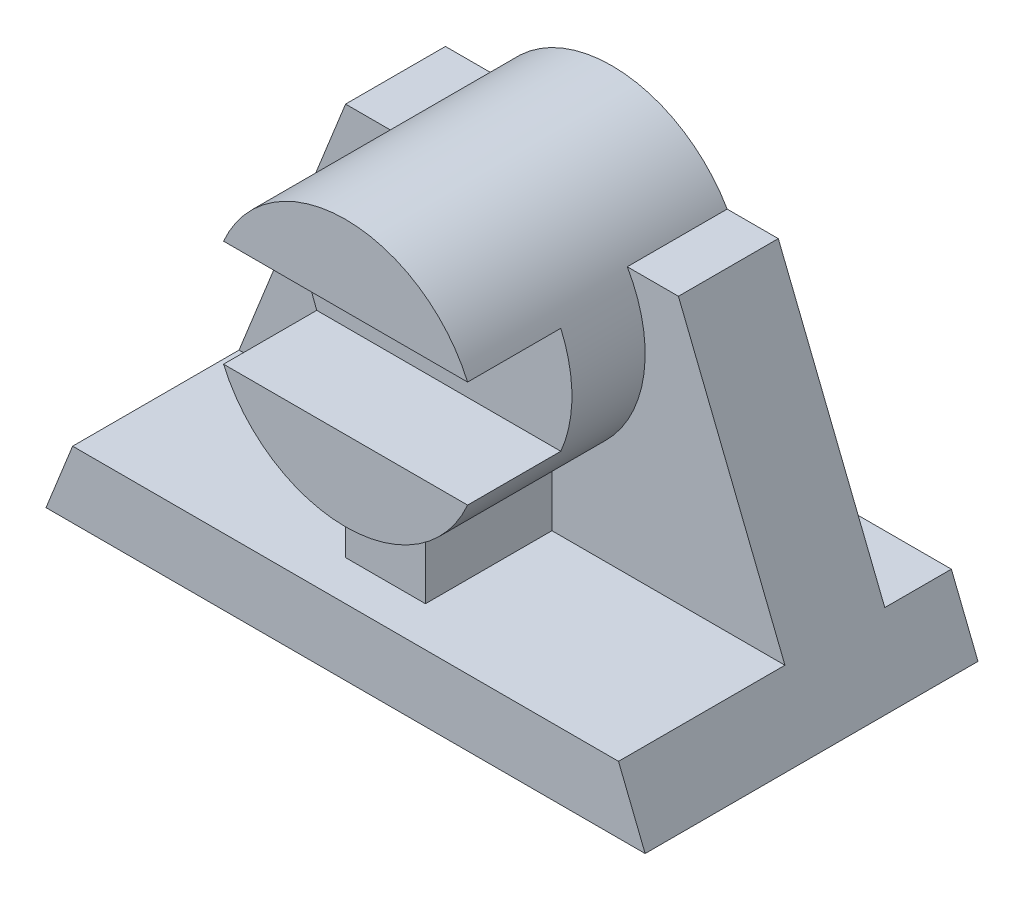
ISO-10303-21;
HEADER;
FILE_DESCRIPTION(('STEP AP214'),'2;1');
FILE_NAME('part.step','',(''),(''),'','','');
FILE_SCHEMA(('AUTOMOTIVE_DESIGN { 1 0 10303 214 1 1 1 1 }'));
ENDSEC;
DATA;
#1=APPLICATION_CONTEXT('core data for automotive mechanical design processes');
#2=APPLICATION_PROTOCOL_DEFINITION('international standard','automotive_design',2000,#1);
#3=PRODUCT_CONTEXT('',#1,'mechanical');
#4=PRODUCT('Part','Part','',(#3));
#5=PRODUCT_RELATED_PRODUCT_CATEGORY('part','',(#4));
#6=PRODUCT_DEFINITION_FORMATION('','',#4);
#7=PRODUCT_DEFINITION_CONTEXT('part definition',#1,'design');
#8=PRODUCT_DEFINITION('design','',#6,#7);
#9=PRODUCT_DEFINITION_SHAPE('','',#8);
#10=(LENGTH_UNIT() NAMED_UNIT(*) SI_UNIT(.MILLI.,.METRE.));
#11=(NAMED_UNIT(*) PLANE_ANGLE_UNIT() SI_UNIT($,.RADIAN.));
#12=(NAMED_UNIT(*) SI_UNIT($,.STERADIAN.) SOLID_ANGLE_UNIT());
#13=UNCERTAINTY_MEASURE_WITH_UNIT(LENGTH_MEASURE(1.E-05),#10,'distance_accuracy_value','');
#14=(GEOMETRIC_REPRESENTATION_CONTEXT(3) GLOBAL_UNCERTAINTY_ASSIGNED_CONTEXT((#13)) GLOBAL_UNIT_ASSIGNED_CONTEXT((#10,
#11,#12)) REPRESENTATION_CONTEXT('',''));
#15=CARTESIAN_POINT('',(0.,0.,0.));
#16=DIRECTION('',(0.,0.,1.));
#17=DIRECTION('',(1.,0.,0.));
#18=AXIS2_PLACEMENT_3D('',#15,#16,#17);
#19=CARTESIAN_POINT('',(0.,0.,40.));
#20=DIRECTION('',(0.,0.,1.));
#21=DIRECTION('',(1.,0.,0.));
#22=AXIS2_PLACEMENT_3D('',#19,#20,#21);
#23=PLANE('',#22);
#24=DIRECTION('',(-1.,0.,0.));
#25=VECTOR('',#24,1.);
#26=CARTESIAN_POINT('',(0.,15.52297370401,40.));
#27=LINE('',#26,#25);
#28=CARTESIAN_POINT('',(-1.36599563520437,15.52297370401,40.));
#29=VERTEX_POINT('',#28);
#30=CARTESIAN_POINT('',(-38.0266011948511,15.52297370401,40.));
#31=VERTEX_POINT('',#30);
#32=EDGE_CURVE('E173',#29,#31,#27,.T.);
#33=ORIENTED_EDGE('',*,*,#32,.F.);
#34=CARTESIAN_POINT('',(-19.6962984150277,7.52297370401,40.));
#35=DIRECTION('',(0.,0.,1.));
#36=DIRECTION('',(1.,0.,0.));
#37=AXIS2_PLACEMENT_3D('',#34,#35,#36);
#38=CIRCLE('',#37,20.);
#39=EDGE_CURVE('E188',#29,#31,#38,.T.);
#40=ORIENTED_EDGE('',*,*,#39,.T.);
#41=EDGE_LOOP('',(#33,#40));
#42=FACE_BOUND('',#41,.T.);
#43=ADVANCED_FACE('F41',(#42),#23,.T.);
#44=CARTESIAN_POINT('',(0.,-22.47702629599,-10.));
#45=DIRECTION('',(0.,-1.,0.));
#46=DIRECTION('',(0.,0.,-1.));
#47=AXIS2_PLACEMENT_3D('',#44,#45,#46);
#48=PLANE('',#47);
#49=DIRECTION('',(0.,0.,1.));
#50=VECTOR('',#49,1.);
#51=CARTESIAN_POINT('',(-60.6962984150277,-22.47702629599,-10.));
#52=LINE('',#51,#50);
#53=CARTESIAN_POINT('',(-60.6962984150277,-22.47702629599,-10.));
#54=VERTEX_POINT('',#53);
#55=CARTESIAN_POINT('',(-60.6962984150277,-22.47702629599,0.));
#56=VERTEX_POINT('',#55);
#57=EDGE_CURVE('E341',#54,#56,#52,.T.);
#58=ORIENTED_EDGE('',*,*,#57,.T.);
#59=DIRECTION('',(1.,0.,0.));
#60=VECTOR('',#59,1.);
#61=CARTESIAN_POINT('',(0.,-22.47702629599,0.));
#62=LINE('',#61,#60);
#63=CARTESIAN_POINT('',(21.3037015849723,-22.47702629599,0.));
#64=VERTEX_POINT('',#63);
#65=EDGE_CURVE('E262',#56,#64,#62,.T.);
#66=ORIENTED_EDGE('',*,*,#65,.T.);
#67=DIRECTION('',(0.,0.,1.));
#68=VECTOR('',#67,1.);
#69=CARTESIAN_POINT('',(21.3037015849723,-22.47702629599,-10.));
#70=LINE('',#69,#68);
#71=CARTESIAN_POINT('',(21.3037015849723,-22.47702629599,-10.));
#72=VERTEX_POINT('',#71);
#73=EDGE_CURVE('E174',#72,#64,#70,.T.);
#74=ORIENTED_EDGE('',*,*,#73,.F.);
#75=DIRECTION('',(1.,0.,0.));
#76=VECTOR('',#75,1.);
#77=CARTESIAN_POINT('',(0.,-22.47702629599,-10.));
#78=LINE('',#77,#76);
#79=EDGE_CURVE('E315',#54,#72,#78,.T.);
#80=ORIENTED_EDGE('',*,*,#79,.F.);
#81=EDGE_LOOP('',(#58,#66,#74,#80));
#82=FACE_BOUND('',#81,.T.);
#83=ADVANCED_FACE('F367',(#82),#48,.F.);
#84=DIRECTION('',(1.,0.,0.));
#85=VECTOR('',#84,1.);
#86=CARTESIAN_POINT('',(0.,-22.47702629599,34.));
#87=LINE('',#86,#85);
#88=CARTESIAN_POINT('',(-25.6962984150277,-22.47702629599,34.));
#89=VERTEX_POINT('',#88);
#90=CARTESIAN_POINT('',(-13.6962984150278,-22.47702629599,34.));
#91=VERTEX_POINT('',#90);
#92=EDGE_CURVE('E65',#89,#91,#87,.T.);
#93=ORIENTED_EDGE('',*,*,#92,.F.);
#94=DIRECTION('',(0.,0.,-1.));
#95=VECTOR('',#94,1.);
#96=CARTESIAN_POINT('',(-25.6962984150277,-22.47702629599,34.));
#97=LINE('',#96,#95);
#98=CARTESIAN_POINT('',(-25.6962984150277,-22.47702629599,15.));
#99=VERTEX_POINT('',#98);
#100=EDGE_CURVE('E222',#89,#99,#97,.T.);
#101=ORIENTED_EDGE('',*,*,#100,.T.);
#102=DIRECTION('',(1.,0.,0.));
#103=VECTOR('',#102,1.);
#104=CARTESIAN_POINT('',(0.,-22.47702629599,15.));
#105=LINE('',#104,#103);
#106=CARTESIAN_POINT('',(-60.6962984150277,-22.47702629599,15.));
#107=VERTEX_POINT('',#106);
#108=EDGE_CURVE('E243',#107,#99,#105,.T.);
#109=ORIENTED_EDGE('',*,*,#108,.F.);
#110=CARTESIAN_POINT('',(-60.6962984150277,-22.47702629599,40.));
#111=VERTEX_POINT('',#110);
#112=EDGE_CURVE('E330',#107,#111,#52,.T.);
#113=ORIENTED_EDGE('',*,*,#112,.T.);
#114=DIRECTION('',(1.,0.,0.));
#115=VECTOR('',#114,1.);
#116=CARTESIAN_POINT('',(0.,-22.47702629599,40.));
#117=LINE('',#116,#115);
#118=CARTESIAN_POINT('',(21.3037015849723,-22.47702629599,40.));
#119=VERTEX_POINT('',#118);
#120=EDGE_CURVE('E299',#111,#119,#117,.T.);
#121=ORIENTED_EDGE('',*,*,#120,.T.);
#122=CARTESIAN_POINT('',(21.3037015849723,-22.47702629599,15.));
#123=VERTEX_POINT('',#122);
#124=EDGE_CURVE('E334',#123,#119,#70,.T.);
#125=ORIENTED_EDGE('',*,*,#124,.F.);
#126=DIRECTION('',(1.,0.,0.));
#127=VECTOR('',#126,1.);
#128=CARTESIAN_POINT('',(0.,-22.47702629599,15.));
#129=LINE('',#128,#127);
#130=CARTESIAN_POINT('',(-13.6962984150278,-22.47702629599,15.));
#131=VERTEX_POINT('',#130);
#132=EDGE_CURVE('E272',#131,#123,#129,.T.);
#133=ORIENTED_EDGE('',*,*,#132,.F.);
#134=DIRECTION('',(0.,0.,-1.));
#135=VECTOR('',#134,1.);
#136=CARTESIAN_POINT('',(-13.6962984150278,-22.47702629599,34.));
#137=LINE('',#136,#135);
#138=EDGE_CURVE('E218',#91,#131,#137,.T.);
#139=ORIENTED_EDGE('',*,*,#138,.F.);
#140=EDGE_LOOP('',(#93,#101,#109,#113,#121,#125,#133,#139));
#141=FACE_BOUND('',#140,.T.);
#142=ADVANCED_FACE('F43',(#141),#48,.F.);
#143=CARTESIAN_POINT('',(10.6145612642899,4.24582450571596,-10.));
#144=DIRECTION('',(-0.928476690885259,-0.371390676354104,0.));
#145=DIRECTION('',(0.371390676354104,-0.928476690885259,0.));
#146=AXIS2_PLACEMENT_3D('',#143,#144,#145);
#147=PLANE('',#146);
#148=ORIENTED_EDGE('',*,*,#73,.T.);
#149=DIRECTION('',(0.371390676354104,-0.928476690885259,0.));
#150=VECTOR('',#149,1.);
#151=CARTESIAN_POINT('',(10.6145612642899,4.24582450571596,0.));
#152=LINE('',#151,#150);
#153=CARTESIAN_POINT('',(5.30370158497228,17.52297370401,0.));
#154=VERTEX_POINT('',#153);
#155=EDGE_CURVE('E287',#154,#64,#152,.T.);
#156=ORIENTED_EDGE('',*,*,#155,.F.);
#157=DIRECTION('',(0.,0.,-1.));
#158=VECTOR('',#157,1.);
#159=CARTESIAN_POINT('',(5.30370158497228,17.52297370401,15.));
#160=LINE('',#159,#158);
#161=CARTESIAN_POINT('',(5.30370158497228,17.52297370401,15.));
#162=VERTEX_POINT('',#161);
#163=EDGE_CURVE('E296',#162,#154,#160,.T.);
#164=ORIENTED_EDGE('',*,*,#163,.F.);
#165=DIRECTION('',(0.371390676354104,-0.928476690885259,0.));
#166=VECTOR('',#165,1.);
#167=CARTESIAN_POINT('',(10.6145612642899,4.24582450571596,15.));
#168=LINE('',#167,#166);
#169=EDGE_CURVE('E275',#162,#123,#168,.T.);
#170=ORIENTED_EDGE('',*,*,#169,.T.);
#171=ORIENTED_EDGE('',*,*,#124,.T.);
#172=DIRECTION('',(0.371390676354104,-0.928476690885259,0.));
#173=VECTOR('',#172,1.);
#174=CARTESIAN_POINT('',(10.6145612642899,4.24582450571596,40.));
#175=LINE('',#174,#173);
#176=CARTESIAN_POINT('',(25.3037015849723,-32.47702629599,40.));
#177=VERTEX_POINT('',#176);
#178=EDGE_CURVE('E311',#119,#177,#175,.T.);
#179=ORIENTED_EDGE('',*,*,#178,.T.);
#180=DIRECTION('',(0.,0.,1.));
#181=VECTOR('',#180,1.);
#182=CARTESIAN_POINT('',(25.3037015849723,-32.47702629599,-10.));
#183=LINE('',#182,#181);
#184=CARTESIAN_POINT('',(25.3037015849723,-32.47702629599,-10.));
#185=VERTEX_POINT('',#184);
#186=EDGE_CURVE('E335',#185,#177,#183,.T.);
#187=ORIENTED_EDGE('',*,*,#186,.F.);
#188=DIRECTION('',(0.371390676354104,-0.928476690885259,0.));
#189=VECTOR('',#188,1.);
#190=CARTESIAN_POINT('',(10.6145612642899,4.24582450571596,-10.));
#191=LINE('',#190,#189);
#192=EDGE_CURVE('E327',#72,#185,#191,.T.);
#193=ORIENTED_EDGE('',*,*,#192,.F.);
#194=EDGE_LOOP('',(#148,#156,#164,#170,#171,#179,#187,#193));
#195=FACE_BOUND('',#194,.T.);
#196=ADVANCED_FACE('F425',(#195),#147,.F.);
#197=CARTESIAN_POINT('',(0.,-32.47702629599,-10.));
#198=DIRECTION('',(0.,-1.,0.));
#199=DIRECTION('',(0.,0.,-1.));
#200=AXIS2_PLACEMENT_3D('',#197,#198,#199);
#201=PLANE('',#200);
#202=ORIENTED_EDGE('',*,*,#186,.T.);
#203=DIRECTION('',(1.,0.,0.));
#204=VECTOR('',#203,1.);
#205=CARTESIAN_POINT('',(0.,-32.47702629599,40.));
#206=LINE('',#205,#204);
#207=CARTESIAN_POINT('',(-64.6962984150277,-32.47702629599,40.));
#208=VERTEX_POINT('',#207);
#209=EDGE_CURVE('E307',#208,#177,#206,.T.);
#210=ORIENTED_EDGE('',*,*,#209,.F.);
#211=DIRECTION('',(0.,0.,1.));
#212=VECTOR('',#211,1.);
#213=CARTESIAN_POINT('',(-64.6962984150277,-32.47702629599,-10.));
#214=LINE('',#213,#212);
#215=CARTESIAN_POINT('',(-64.6962984150277,-32.47702629599,-10.));
#216=VERTEX_POINT('',#215);
#217=EDGE_CURVE('E338',#216,#208,#214,.T.);
#218=ORIENTED_EDGE('',*,*,#217,.F.);
#219=DIRECTION('',(1.,0.,0.));
#220=VECTOR('',#219,1.);
#221=CARTESIAN_POINT('',(0.,-32.47702629599,-10.));
#222=LINE('',#221,#220);
#223=EDGE_CURVE('E323',#216,#185,#222,.T.);
#224=ORIENTED_EDGE('',*,*,#223,.T.);
#225=EDGE_LOOP('',(#202,#210,#218,#224));
#226=FACE_BOUND('',#225,.T.);
#227=ADVANCED_FACE('F428',(#226),#201,.T.);
#228=CARTESIAN_POINT('',(-44.5736964626136,17.8294785850454,-10.));
#229=DIRECTION('',(-0.928476690885259,0.371390676354104,0.));
#230=DIRECTION('',(-0.371390676354104,-0.928476690885259,0.));
#231=AXIS2_PLACEMENT_3D('',#228,#229,#230);
#232=PLANE('',#231);
#233=ORIENTED_EDGE('',*,*,#217,.T.);
#234=DIRECTION('',(-0.371390676354104,-0.928476690885259,0.));
#235=VECTOR('',#234,1.);
#236=CARTESIAN_POINT('',(-44.5736964626136,17.8294785850454,40.));
#237=LINE('',#236,#235);
#238=EDGE_CURVE('E303',#111,#208,#237,.T.);
#239=ORIENTED_EDGE('',*,*,#238,.F.);
#240=ORIENTED_EDGE('',*,*,#112,.F.);
#241=DIRECTION('',(-0.371390676354104,-0.928476690885259,0.));
#242=VECTOR('',#241,1.);
#243=CARTESIAN_POINT('',(-44.5736964626136,17.8294785850454,15.));
#244=LINE('',#243,#242);
#245=CARTESIAN_POINT('',(-44.6962984150277,17.52297370401,15.));
#246=VERTEX_POINT('',#245);
#247=EDGE_CURVE('E239',#246,#107,#244,.T.);
#248=ORIENTED_EDGE('',*,*,#247,.F.);
#249=DIRECTION('',(0.,0.,-1.));
#250=VECTOR('',#249,1.);
#251=CARTESIAN_POINT('',(-44.6962984150277,17.52297370401,15.));
#252=LINE('',#251,#250);
#253=CARTESIAN_POINT('',(-44.6962984150277,17.52297370401,0.));
#254=VERTEX_POINT('',#253);
#255=EDGE_CURVE('E250',#246,#254,#252,.T.);
#256=ORIENTED_EDGE('',*,*,#255,.T.);
#257=DIRECTION('',(-0.371390676354104,-0.928476690885259,0.));
#258=VECTOR('',#257,1.);
#259=CARTESIAN_POINT('',(-44.5736964626136,17.8294785850454,0.));
#260=LINE('',#259,#258);
#261=EDGE_CURVE('E235',#254,#56,#260,.T.);
#262=ORIENTED_EDGE('',*,*,#261,.T.);
#263=ORIENTED_EDGE('',*,*,#57,.F.);
#264=DIRECTION('',(-0.371390676354104,-0.928476690885259,0.));
#265=VECTOR('',#264,1.);
#266=CARTESIAN_POINT('',(-44.5736964626136,17.8294785850454,-10.));
#267=LINE('',#266,#265);
#268=EDGE_CURVE('E319',#54,#216,#267,.T.);
#269=ORIENTED_EDGE('',*,*,#268,.T.);
#270=EDGE_LOOP('',(#233,#239,#240,#248,#256,#262,#263,#269));
#271=FACE_BOUND('',#270,.T.);
#272=ADVANCED_FACE('F423',(#271),#232,.T.);
#273=CARTESIAN_POINT('',(0.,0.,-10.));
#274=DIRECTION('',(0.,0.,1.));
#275=DIRECTION('',(1.,0.,0.));
#276=AXIS2_PLACEMENT_3D('',#273,#274,#275);
#277=PLANE('',#276);
#278=ORIENTED_EDGE('',*,*,#79,.T.);
#279=ORIENTED_EDGE('',*,*,#192,.T.);
#280=ORIENTED_EDGE('',*,*,#223,.F.);
#281=ORIENTED_EDGE('',*,*,#268,.F.);
#282=EDGE_LOOP('',(#278,#279,#280,#281));
#283=FACE_BOUND('',#282,.T.);
#284=ADVANCED_FACE('F419',(#283),#277,.F.);
#285=CARTESIAN_POINT('',(0.,0.,40.));
#286=DIRECTION('',(0.,0.,1.));
#287=DIRECTION('',(1.,0.,0.));
#288=AXIS2_PLACEMENT_3D('',#285,#286,#287);
#289=PLANE('',#288);
#290=ORIENTED_EDGE('',*,*,#120,.F.);
#291=ORIENTED_EDGE('',*,*,#238,.T.);
#292=ORIENTED_EDGE('',*,*,#209,.T.);
#293=ORIENTED_EDGE('',*,*,#178,.F.);
#294=EDGE_LOOP('',(#290,#291,#292,#293));
#295=FACE_BOUND('',#294,.T.);
#296=ADVANCED_FACE('F415',(#295),#289,.T.);
#297=CARTESIAN_POINT('',(0.,17.52297370401,15.));
#298=DIRECTION('',(0.,1.,0.));
#299=DIRECTION('',(0.,0.,1.));
#300=AXIS2_PLACEMENT_3D('',#297,#298,#299);
#301=PLANE('',#300);
#302=DIRECTION('',(1.,0.,0.));
#303=VECTOR('',#302,1.);
#304=CARTESIAN_POINT('',(0.,17.52297370401,0.));
#305=LINE('',#304,#303);
#306=CARTESIAN_POINT('',(-2.37579033933896,17.52297370401,0.));
#307=VERTEX_POINT('',#306);
#308=EDGE_CURVE('E268',#307,#154,#305,.T.);
#309=ORIENTED_EDGE('',*,*,#308,.F.);
#310=DIRECTION('',(0.,0.,-1.));
#311=VECTOR('',#310,1.);
#312=CARTESIAN_POINT('',(-2.37579033933896,17.52297370401,15.));
#313=LINE('',#312,#311);
#314=CARTESIAN_POINT('',(-2.37579033933896,17.52297370401,15.));
#315=VERTEX_POINT('',#314);
#316=EDGE_CURVE('E283',#315,#307,#313,.T.);
#317=ORIENTED_EDGE('',*,*,#316,.F.);
#318=DIRECTION('',(1.,0.,0.));
#319=VECTOR('',#318,1.);
#320=CARTESIAN_POINT('',(0.,17.52297370401,15.));
#321=LINE('',#320,#319);
#322=EDGE_CURVE('E279',#315,#162,#321,.T.);
#323=ORIENTED_EDGE('',*,*,#322,.T.);
#324=ORIENTED_EDGE('',*,*,#163,.T.);
#325=EDGE_LOOP('',(#309,#317,#323,#324));
#326=FACE_BOUND('',#325,.T.);
#327=ADVANCED_FACE('F408',(#326),#301,.T.);
#328=CARTESIAN_POINT('',(0.,0.,15.));
#329=DIRECTION('',(0.,0.,1.));
#330=DIRECTION('',(1.,0.,0.));
#331=AXIS2_PLACEMENT_3D('',#328,#329,#330);
#332=PLANE('',#331);
#333=CARTESIAN_POINT('',(-19.6962984150277,7.52297370401,15.));
#334=DIRECTION('',(0.,0.,1.));
#335=DIRECTION('',(1.,0.,0.));
#336=AXIS2_PLACEMENT_3D('',#333,#334,#335);
#337=CIRCLE('',#336,20.);
#338=CARTESIAN_POINT('',(-13.6962984150278,-11.5558103243289,15.));
#339=VERTEX_POINT('',#338);
#340=EDGE_CURVE('E263',#339,#315,#337,.T.);
#341=ORIENTED_EDGE('',*,*,#340,.F.);
#342=DIRECTION('',(0.,1.,0.));
#343=VECTOR('',#342,1.);
#344=CARTESIAN_POINT('',(-13.6962984150278,0.,15.));
#345=LINE('',#344,#343);
#346=EDGE_CURVE('E267',#131,#339,#345,.T.);
#347=ORIENTED_EDGE('',*,*,#346,.F.);
#348=ORIENTED_EDGE('',*,*,#132,.T.);
#349=ORIENTED_EDGE('',*,*,#169,.F.);
#350=ORIENTED_EDGE('',*,*,#322,.F.);
#351=EDGE_LOOP('',(#341,#347,#348,#349,#350));
#352=FACE_BOUND('',#351,.T.);
#353=ADVANCED_FACE('F405',(#352),#332,.T.);
#354=CARTESIAN_POINT('',(0.,0.,0.));
#355=DIRECTION('',(0.,0.,1.));
#356=DIRECTION('',(1.,0.,0.));
#357=AXIS2_PLACEMENT_3D('',#354,#355,#356);
#358=PLANE('',#357);
#359=DIRECTION('',(1.,0.,0.));
#360=VECTOR('',#359,1.);
#361=CARTESIAN_POINT('',(0.,17.52297370401,0.));
#362=LINE('',#361,#360);
#363=CARTESIAN_POINT('',(-37.0168064907165,17.52297370401,0.));
#364=VERTEX_POINT('',#363);
#365=EDGE_CURVE('E229',#254,#364,#362,.T.);
#366=ORIENTED_EDGE('',*,*,#365,.T.);
#367=CARTESIAN_POINT('',(-19.6962984150277,7.52297370401,0.));
#368=DIRECTION('',(0.,0.,1.));
#369=DIRECTION('',(1.,0.,0.));
#370=AXIS2_PLACEMENT_3D('',#367,#368,#369);
#371=CIRCLE('',#370,20.);
#372=EDGE_CURVE('E189',#307,#364,#371,.T.);
#373=ORIENTED_EDGE('',*,*,#372,.F.);
#374=ORIENTED_EDGE('',*,*,#308,.T.);
#375=ORIENTED_EDGE('',*,*,#155,.T.);
#376=ORIENTED_EDGE('',*,*,#65,.F.);
#377=ORIENTED_EDGE('',*,*,#261,.F.);
#378=EDGE_LOOP('',(#366,#373,#374,#375,#376,#377));
#379=FACE_BOUND('',#378,.T.);
#380=ADVANCED_FACE('F403',(#379),#358,.F.);
#381=CARTESIAN_POINT('',(0.,17.52297370401,15.));
#382=DIRECTION('',(0.,1.,0.));
#383=DIRECTION('',(0.,0.,1.));
#384=AXIS2_PLACEMENT_3D('',#381,#382,#383);
#385=PLANE('',#384);
#386=ORIENTED_EDGE('',*,*,#365,.F.);
#387=ORIENTED_EDGE('',*,*,#255,.F.);
#388=DIRECTION('',(1.,0.,0.));
#389=VECTOR('',#388,1.);
#390=CARTESIAN_POINT('',(0.,17.52297370401,15.));
#391=LINE('',#390,#389);
#392=CARTESIAN_POINT('',(-37.0168064907165,17.52297370401,15.));
#393=VERTEX_POINT('',#392);
#394=EDGE_CURVE('E234',#246,#393,#391,.T.);
#395=ORIENTED_EDGE('',*,*,#394,.T.);
#396=DIRECTION('',(0.,0.,-1.));
#397=VECTOR('',#396,1.);
#398=CARTESIAN_POINT('',(-37.0168064907165,17.52297370401,15.));
#399=LINE('',#398,#397);
#400=EDGE_CURVE('E259',#393,#364,#399,.T.);
#401=ORIENTED_EDGE('',*,*,#400,.T.);
#402=EDGE_LOOP('',(#386,#387,#395,#401));
#403=FACE_BOUND('',#402,.T.);
#404=ADVANCED_FACE('F399',(#403),#385,.T.);
#405=CARTESIAN_POINT('',(0.,0.,15.));
#406=DIRECTION('',(0.,0.,1.));
#407=DIRECTION('',(1.,0.,0.));
#408=AXIS2_PLACEMENT_3D('',#405,#406,#407);
#409=PLANE('',#408);
#410=CARTESIAN_POINT('',(-19.6962984150277,7.52297370401,15.));
#411=DIRECTION('',(0.,0.,1.));
#412=DIRECTION('',(1.,0.,0.));
#413=AXIS2_PLACEMENT_3D('',#410,#411,#412);
#414=CIRCLE('',#413,20.);
#415=CARTESIAN_POINT('',(-25.6962984150277,-11.5558103243289,15.));
#416=VERTEX_POINT('',#415);
#417=EDGE_CURVE('E230',#393,#416,#414,.T.);
#418=ORIENTED_EDGE('',*,*,#417,.F.);
#419=ORIENTED_EDGE('',*,*,#394,.F.);
#420=ORIENTED_EDGE('',*,*,#247,.T.);
#421=ORIENTED_EDGE('',*,*,#108,.T.);
#422=DIRECTION('',(0.,1.,0.));
#423=VECTOR('',#422,1.);
#424=CARTESIAN_POINT('',(-25.6962984150277,0.,15.));
#425=LINE('',#424,#423);
#426=EDGE_CURVE('E247',#99,#416,#425,.T.);
#427=ORIENTED_EDGE('',*,*,#426,.T.);
#428=EDGE_LOOP('',(#418,#419,#420,#421,#427));
#429=FACE_BOUND('',#428,.T.);
#430=ADVANCED_FACE('F395',(#429),#409,.T.);
#431=CARTESIAN_POINT('',(-25.6962984150277,0.,34.));
#432=DIRECTION('',(-1.,0.,0.));
#433=DIRECTION('',(0.,0.,1.));
#434=AXIS2_PLACEMENT_3D('',#431,#432,#433);
#435=PLANE('',#434);
#436=DIRECTION('',(0.,0.,-1.));
#437=VECTOR('',#436,1.);
#438=CARTESIAN_POINT('',(-25.6962984150277,-11.5558103243289,34.));
#439=LINE('',#438,#437);
#440=CARTESIAN_POINT('',(-25.6962984150277,-11.5558103243289,34.));
#441=VERTEX_POINT('',#440);
#442=EDGE_CURVE('E225',#441,#416,#439,.T.);
#443=ORIENTED_EDGE('',*,*,#442,.T.);
#444=ORIENTED_EDGE('',*,*,#426,.F.);
#445=ORIENTED_EDGE('',*,*,#100,.F.);
#446=DIRECTION('',(0.,1.,0.));
#447=VECTOR('',#446,1.);
#448=CARTESIAN_POINT('',(-25.6962984150277,0.,34.));
#449=LINE('',#448,#447);
#450=EDGE_CURVE('E204',#89,#441,#449,.T.);
#451=ORIENTED_EDGE('',*,*,#450,.T.);
#452=EDGE_LOOP('',(#443,#444,#445,#451));
#453=FACE_BOUND('',#452,.T.);
#454=ADVANCED_FACE('F391',(#453),#435,.T.);
#455=CARTESIAN_POINT('',(-13.6962984150278,0.,34.));
#456=DIRECTION('',(-1.,0.,0.));
#457=DIRECTION('',(0.,0.,1.));
#458=AXIS2_PLACEMENT_3D('',#455,#456,#457);
#459=PLANE('',#458);
#460=ORIENTED_EDGE('',*,*,#346,.T.);
#461=DIRECTION('',(0.,0.,-1.));
#462=VECTOR('',#461,1.);
#463=CARTESIAN_POINT('',(-13.6962984150278,-11.5558103243289,34.));
#464=LINE('',#463,#462);
#465=CARTESIAN_POINT('',(-13.6962984150278,-11.5558103243289,34.));
#466=VERTEX_POINT('',#465);
#467=EDGE_CURVE('E214',#466,#339,#464,.T.);
#468=ORIENTED_EDGE('',*,*,#467,.F.);
#469=DIRECTION('',(0.,1.,0.));
#470=VECTOR('',#469,1.);
#471=CARTESIAN_POINT('',(-13.6962984150278,0.,34.));
#472=LINE('',#471,#470);
#473=EDGE_CURVE('E210',#91,#466,#472,.T.);
#474=ORIENTED_EDGE('',*,*,#473,.F.);
#475=ORIENTED_EDGE('',*,*,#138,.T.);
#476=EDGE_LOOP('',(#460,#468,#474,#475));
#477=FACE_BOUND('',#476,.T.);
#478=ADVANCED_FACE('F385',(#477),#459,.F.);
#479=CARTESIAN_POINT('',(0.,0.,34.));
#480=DIRECTION('',(0.,0.,1.));
#481=DIRECTION('',(1.,0.,0.));
#482=AXIS2_PLACEMENT_3D('',#479,#480,#481);
#483=PLANE('',#482);
#484=CARTESIAN_POINT('',(-19.6962984150277,7.52297370401,34.));
#485=DIRECTION('',(0.,0.,1.));
#486=DIRECTION('',(1.,0.,0.));
#487=AXIS2_PLACEMENT_3D('',#484,#485,#486);
#488=CIRCLE('',#487,20.);
#489=EDGE_CURVE('E194',#441,#466,#488,.T.);
#490=ORIENTED_EDGE('',*,*,#489,.F.);
#491=ORIENTED_EDGE('',*,*,#450,.F.);
#492=ORIENTED_EDGE('',*,*,#92,.T.);
#493=ORIENTED_EDGE('',*,*,#473,.T.);
#494=EDGE_LOOP('',(#490,#491,#492,#493));
#495=FACE_BOUND('',#494,.T.);
#496=ADVANCED_FACE('F381',(#495),#483,.T.);
#497=CARTESIAN_POINT('',(-19.6962984150277,7.52297370401,40.));
#498=DIRECTION('',(0.,0.,-1.));
#499=DIRECTION('',(-1.,0.,0.));
#500=AXIS2_PLACEMENT_3D('',#497,#498,#499);
#501=CYLINDRICAL_SURFACE('',#500,20.);
#502=CARTESIAN_POINT('',(-19.6962984150277,7.52297370401,26.));
#503=DIRECTION('',(0.,0.,1.));
#504=DIRECTION('',(1.,0.,0.));
#505=AXIS2_PLACEMENT_3D('',#502,#503,#504);
#506=CIRCLE('',#505,20.);
#507=CARTESIAN_POINT('',(-38.0266011948511,15.52297370401,26.));
#508=VERTEX_POINT('',#507);
#509=CARTESIAN_POINT('',(-38.0266011948511,-0.477026295990002,26.));
#510=VERTEX_POINT('',#509);
#511=EDGE_CURVE('E11',#508,#510,#506,.T.);
#512=ORIENTED_EDGE('',*,*,#511,.F.);
#513=DIRECTION('',(0.,0.,-1.));
#514=VECTOR('',#513,1.);
#515=CARTESIAN_POINT('',(-38.0266011948511,15.52297370401,40.));
#516=LINE('',#515,#514);
#517=EDGE_CURVE('E355',#508,#31,#516,.F.);
#518=ORIENTED_EDGE('',*,*,#517,.T.);
#519=ORIENTED_EDGE('',*,*,#39,.F.);
#520=DIRECTION('',(0.,0.,-1.));
#521=VECTOR('',#520,1.);
#522=CARTESIAN_POINT('',(-1.36599563520437,15.52297370401,40.));
#523=LINE('',#522,#521);
#524=CARTESIAN_POINT('',(-1.36599563520437,15.52297370401,26.));
#525=VERTEX_POINT('',#524);
#526=EDGE_CURVE('E196',#29,#525,#523,.T.);
#527=ORIENTED_EDGE('',*,*,#526,.T.);
#528=CARTESIAN_POINT('',(-1.36599563520437,-0.477026295990002,26.));
#529=VERTEX_POINT('',#528);
#530=EDGE_CURVE('E45',#529,#525,#506,.T.);
#531=ORIENTED_EDGE('',*,*,#530,.F.);
#532=DIRECTION('',(0.,0.,-1.));
#533=VECTOR('',#532,1.);
#534=CARTESIAN_POINT('',(-1.36599563520437,-0.477026295990002,40.));
#535=LINE('',#534,#533);
#536=CARTESIAN_POINT('',(-1.36599563520437,-0.477026295990002,40.));
#537=VERTEX_POINT('',#536);
#538=EDGE_CURVE('E167',#529,#537,#535,.F.);
#539=ORIENTED_EDGE('',*,*,#538,.T.);
#540=CARTESIAN_POINT('',(-38.0266011948511,-0.477026295990002,40.));
#541=VERTEX_POINT('',#540);
#542=EDGE_CURVE('E181',#541,#537,#38,.T.);
#543=ORIENTED_EDGE('',*,*,#542,.F.);
#544=DIRECTION('',(0.,0.,-1.));
#545=VECTOR('',#544,1.);
#546=CARTESIAN_POINT('',(-38.0266011948511,-0.477026295990002,40.));
#547=LINE('',#546,#545);
#548=EDGE_CURVE('E57',#541,#510,#547,.T.);
#549=ORIENTED_EDGE('',*,*,#548,.T.);
#550=EDGE_LOOP('',(#512,#518,#519,#527,#531,#539,#543,#549));
#551=FACE_BOUND('',#550,.T.);
#552=ORIENTED_EDGE('',*,*,#316,.T.);
#553=ORIENTED_EDGE('',*,*,#372,.T.);
#554=ORIENTED_EDGE('',*,*,#400,.F.);
#555=ORIENTED_EDGE('',*,*,#417,.T.);
#556=ORIENTED_EDGE('',*,*,#442,.F.);
#557=ORIENTED_EDGE('',*,*,#489,.T.);
#558=ORIENTED_EDGE('',*,*,#467,.T.);
#559=ORIENTED_EDGE('',*,*,#340,.T.);
#560=EDGE_LOOP('',(#552,#553,#554,#555,#556,#557,#558,#559));
#561=FACE_BOUND('',#560,.T.);
#562=ADVANCED_FACE('F179',(#551,#561),#501,.T.);
#563=DIRECTION('',(1.,0.,0.));
#564=VECTOR('',#563,1.);
#565=CARTESIAN_POINT('',(0.,-0.477026295990002,40.));
#566=LINE('',#565,#564);
#567=EDGE_CURVE('E164',#541,#537,#566,.T.);
#568=ORIENTED_EDGE('',*,*,#567,.F.);
#569=ORIENTED_EDGE('',*,*,#542,.T.);
#570=EDGE_LOOP('',(#568,#569));
#571=FACE_BOUND('',#570,.T.);
#572=ADVANCED_FACE('F186',(#571),#23,.T.);
#573=CARTESIAN_POINT('',(-39.6962984150277,7.52297370401,26.));
#574=DIRECTION('',(0.,0.,1.));
#575=DIRECTION('',(1.,0.,0.));
#576=AXIS2_PLACEMENT_3D('',#573,#574,#575);
#577=PLANE('',#576);
#578=ORIENTED_EDGE('',*,*,#511,.T.);
#579=DIRECTION('',(1.,0.,0.));
#580=VECTOR('',#579,1.);
#581=CARTESIAN_POINT('',(-39.6962984150277,-0.477026295990002,26.));
#582=LINE('',#581,#580);
#583=EDGE_CURVE('E353',#510,#529,#582,.T.);
#584=ORIENTED_EDGE('',*,*,#583,.T.);
#585=ORIENTED_EDGE('',*,*,#530,.T.);
#586=DIRECTION('',(-1.,0.,0.));
#587=VECTOR('',#586,1.);
#588=CARTESIAN_POINT('',(-39.6962984150277,15.52297370401,26.));
#589=LINE('',#588,#587);
#590=EDGE_CURVE('E184',#525,#508,#589,.T.);
#591=ORIENTED_EDGE('',*,*,#590,.T.);
#592=EDGE_LOOP('',(#578,#584,#585,#591));
#593=FACE_BOUND('',#592,.T.);
#594=ADVANCED_FACE('F352',(#593),#577,.T.);
#595=CARTESIAN_POINT('',(-39.6962984150277,15.52297370401,26.));
#596=DIRECTION('',(0.,1.,0.));
#597=DIRECTION('',(0.,0.,1.));
#598=AXIS2_PLACEMENT_3D('',#595,#596,#597);
#599=PLANE('',#598);
#600=ORIENTED_EDGE('',*,*,#32,.T.);
#601=ORIENTED_EDGE('',*,*,#517,.F.);
#602=ORIENTED_EDGE('',*,*,#590,.F.);
#603=ORIENTED_EDGE('',*,*,#526,.F.);
#604=EDGE_LOOP('',(#600,#601,#602,#603));
#605=FACE_BOUND('',#604,.T.);
#606=ADVANCED_FACE('F354',(#605),#599,.F.);
#607=CARTESIAN_POINT('',(-39.6962984150277,-0.477026295990002,26.));
#608=DIRECTION('',(0.,-1.,0.));
#609=DIRECTION('',(0.,0.,-1.));
#610=AXIS2_PLACEMENT_3D('',#607,#608,#609);
#611=PLANE('',#610);
#612=ORIENTED_EDGE('',*,*,#567,.T.);
#613=ORIENTED_EDGE('',*,*,#538,.F.);
#614=ORIENTED_EDGE('',*,*,#583,.F.);
#615=ORIENTED_EDGE('',*,*,#548,.F.);
#616=EDGE_LOOP('',(#612,#613,#614,#615));
#617=FACE_BOUND('',#616,.T.);
#618=ADVANCED_FACE('F166',(#617),#611,.F.);
#619=CLOSED_SHELL('',(#43,#83,#142,#196,#227,#272,#284,#296,#327,#353,#380,#404,#430,#454,#478,
#496,#562,#572,#594,#606,#618));
#620=MANIFOLD_SOLID_BREP('B2',#619);
#621=ADVANCED_BREP_SHAPE_REPRESENTATION('',(#18,#620),#14);
#622=SHAPE_DEFINITION_REPRESENTATION(#9,#621);
ENDSEC;
END-ISO-10303-21;
